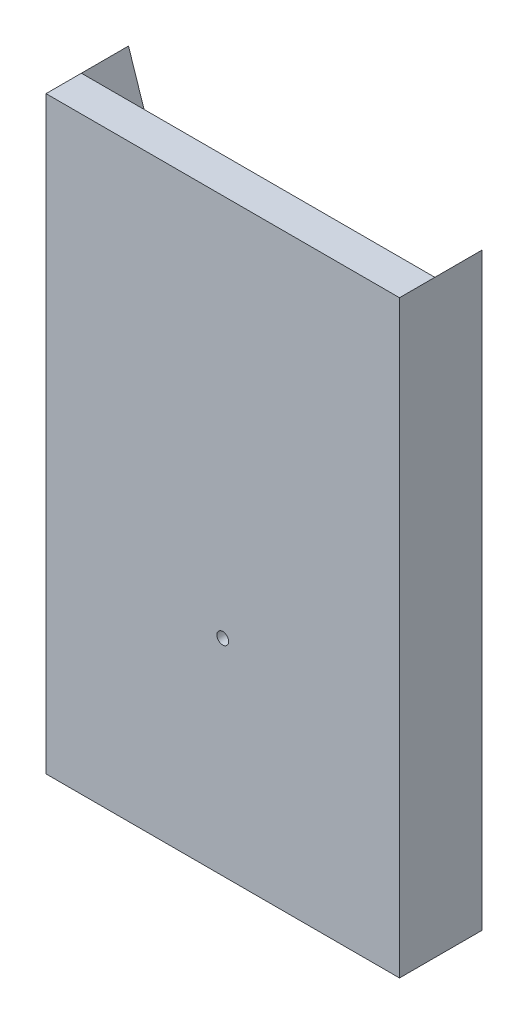
ISO-10303-21;
HEADER;
FILE_DESCRIPTION(('STEP AP214'),'2;1');
FILE_NAME('part.step','',(''),(''),'','','');
FILE_SCHEMA(('AUTOMOTIVE_DESIGN { 1 0 10303 214 1 1 1 1 }'));
ENDSEC;
DATA;
#1=APPLICATION_CONTEXT('core data for automotive mechanical design processes');
#2=APPLICATION_PROTOCOL_DEFINITION('international standard','automotive_design',2000,#1);
#3=PRODUCT_CONTEXT('',#1,'mechanical');
#4=PRODUCT('Part','Part','',(#3));
#5=PRODUCT_RELATED_PRODUCT_CATEGORY('part','',(#4));
#6=PRODUCT_DEFINITION_FORMATION('','',#4);
#7=PRODUCT_DEFINITION_CONTEXT('part definition',#1,'design');
#8=PRODUCT_DEFINITION('design','',#6,#7);
#9=PRODUCT_DEFINITION_SHAPE('','',#8);
#10=(LENGTH_UNIT() NAMED_UNIT(*) SI_UNIT(.MILLI.,.METRE.));
#11=(NAMED_UNIT(*) PLANE_ANGLE_UNIT() SI_UNIT($,.RADIAN.));
#12=(NAMED_UNIT(*) SI_UNIT($,.STERADIAN.) SOLID_ANGLE_UNIT());
#13=UNCERTAINTY_MEASURE_WITH_UNIT(LENGTH_MEASURE(1.E-05),#10,'distance_accuracy_value','');
#14=(GEOMETRIC_REPRESENTATION_CONTEXT(3) GLOBAL_UNCERTAINTY_ASSIGNED_CONTEXT((#13)) GLOBAL_UNIT_ASSIGNED_CONTEXT((#10,
#11,#12)) REPRESENTATION_CONTEXT('',''));
#15=CARTESIAN_POINT('',(0.,0.,0.));
#16=DIRECTION('',(0.,0.,1.));
#17=DIRECTION('',(1.,0.,0.));
#18=AXIS2_PLACEMENT_3D('',#15,#16,#17);
#19=CARTESIAN_POINT('',(0.,0.,0.));
#20=DIRECTION('',(0.,0.,1.));
#21=DIRECTION('',(1.,0.,0.));
#22=AXIS2_PLACEMENT_3D('',#19,#20,#21);
#23=PLANE('',#22);
#24=DIRECTION('',(0.313714078907655,-0.949517496781982,0.));
#25=VECTOR('',#24,1.);
#26=CARTESIAN_POINT('',(0.,0.,0.));
#27=LINE('',#26,#25);
#28=CARTESIAN_POINT('',(0.,0.,0.));
#29=VERTEX_POINT('',#28);
#30=CARTESIAN_POINT('',(44.9946453721645,-136.185163226119,0.));
#31=VERTEX_POINT('',#30);
#32=EDGE_CURVE('E129',#29,#31,#27,.T.);
#33=ORIENTED_EDGE('',*,*,#32,.T.);
#34=CARTESIAN_POINT('',(75.,-162.636603520701,0.));
#35=DIRECTION('',(0.,0.,1.));
#36=DIRECTION('',(1.,0.,0.));
#37=AXIS2_PLACEMENT_3D('',#34,#35,#36);
#38=CIRCLE('',#37,40.);
#39=CARTESIAN_POINT('',(44.9946453721645,-189.088043815283,0.));
#40=VERTEX_POINT('',#39);
#41=EDGE_CURVE('E197',#31,#40,#38,.T.);
#42=ORIENTED_EDGE('',*,*,#41,.T.);
#43=DIRECTION('',(-0.594158454407836,-0.804348016132129,0.));
#44=VECTOR('',#43,1.);
#45=CARTESIAN_POINT('',(44.9946453721645,-189.088043815283,0.));
#46=LINE('',#45,#44);
#47=CARTESIAN_POINT('',(0.,-250.,0.));
#48=VERTEX_POINT('',#47);
#49=EDGE_CURVE('E202',#40,#48,#46,.T.);
#50=ORIENTED_EDGE('',*,*,#49,.T.);
#51=DIRECTION('',(0.,-1.,0.));
#52=VECTOR('',#51,1.);
#53=CARTESIAN_POINT('',(0.,0.,0.));
#54=LINE('',#53,#52);
#55=EDGE_CURVE('E135',#29,#48,#54,.T.);
#56=ORIENTED_EDGE('',*,*,#55,.F.);
#57=EDGE_LOOP('',(#33,#42,#50,#56));
#58=FACE_BOUND('',#57,.T.);
#59=ADVANCED_FACE('F38',(#58),#23,.F.);
#60=DIRECTION('',(-0.594158454407835,0.804348016132129,0.));
#61=VECTOR('',#60,1.);
#62=CARTESIAN_POINT('',(105.005354627836,-189.088043815283,0.));
#63=LINE('',#62,#61);
#64=CARTESIAN_POINT('',(150.,-250.,0.));
#65=VERTEX_POINT('',#64);
#66=CARTESIAN_POINT('',(105.005354627836,-189.088043815283,0.));
#67=VERTEX_POINT('',#66);
#68=EDGE_CURVE('E206',#65,#67,#63,.T.);
#69=ORIENTED_EDGE('',*,*,#68,.T.);
#70=CARTESIAN_POINT('',(75.,-162.636603520701,0.));
#71=DIRECTION('',(0.,0.,1.));
#72=DIRECTION('',(1.,0.,0.));
#73=AXIS2_PLACEMENT_3D('',#70,#71,#72);
#74=CIRCLE('',#73,40.);
#75=CARTESIAN_POINT('',(105.005354627836,-136.185163226119,0.));
#76=VERTEX_POINT('',#75);
#77=EDGE_CURVE('E210',#67,#76,#74,.T.);
#78=ORIENTED_EDGE('',*,*,#77,.T.);
#79=DIRECTION('',(0.313714078907655,0.949517496781982,0.));
#80=VECTOR('',#79,1.);
#81=CARTESIAN_POINT('',(150.,0.,0.));
#82=LINE('',#81,#80);
#83=CARTESIAN_POINT('',(150.,0.,0.));
#84=VERTEX_POINT('',#83);
#85=EDGE_CURVE('E146',#76,#84,#82,.T.);
#86=ORIENTED_EDGE('',*,*,#85,.T.);
#87=DIRECTION('',(0.,1.,0.));
#88=VECTOR('',#87,1.);
#89=CARTESIAN_POINT('',(150.,0.,0.));
#90=LINE('',#89,#88);
#91=EDGE_CURVE('E158',#65,#84,#90,.T.);
#92=ORIENTED_EDGE('',*,*,#91,.F.);
#93=EDGE_LOOP('',(#69,#78,#86,#92));
#94=FACE_BOUND('',#93,.T.);
#95=ADVANCED_FACE('F244',(#94),#23,.F.);
#96=CARTESIAN_POINT('',(0.,0.,35.));
#97=DIRECTION('',(1.,0.,0.));
#98=DIRECTION('',(0.,1.,0.));
#99=AXIS2_PLACEMENT_3D('',#96,#97,#98);
#100=PLANE('',#99);
#101=ORIENTED_EDGE('',*,*,#55,.T.);
#102=DIRECTION('',(0.,0.,-1.));
#103=VECTOR('',#102,1.);
#104=CARTESIAN_POINT('',(0.,-250.,20.));
#105=LINE('',#104,#103);
#106=CARTESIAN_POINT('',(0.,-250.,20.));
#107=VERTEX_POINT('',#106);
#108=EDGE_CURVE('E228',#107,#48,#105,.T.);
#109=ORIENTED_EDGE('',*,*,#108,.F.);
#110=DIRECTION('',(0.,0.,-1.));
#111=VECTOR('',#110,1.);
#112=CARTESIAN_POINT('',(0.,-250.,35.));
#113=LINE('',#112,#111);
#114=CARTESIAN_POINT('',(0.,-250.,35.));
#115=VERTEX_POINT('',#114);
#116=EDGE_CURVE('E11',#115,#107,#113,.T.);
#117=ORIENTED_EDGE('',*,*,#116,.F.);
#118=DIRECTION('',(0.,-1.,0.));
#119=VECTOR('',#118,1.);
#120=CARTESIAN_POINT('',(0.,0.,35.));
#121=LINE('',#120,#119);
#122=CARTESIAN_POINT('',(0.,0.,35.));
#123=VERTEX_POINT('',#122);
#124=EDGE_CURVE('E149',#123,#115,#121,.T.);
#125=ORIENTED_EDGE('',*,*,#124,.F.);
#126=DIRECTION('',(0.,0.,-1.));
#127=VECTOR('',#126,1.);
#128=CARTESIAN_POINT('',(0.,0.,35.));
#129=LINE('',#128,#127);
#130=CARTESIAN_POINT('',(0.,0.,20.));
#131=VERTEX_POINT('',#130);
#132=EDGE_CURVE('E141',#123,#131,#129,.T.);
#133=ORIENTED_EDGE('',*,*,#132,.T.);
#134=DIRECTION('',(0.,0.,-1.));
#135=VECTOR('',#134,1.);
#136=CARTESIAN_POINT('',(0.,0.,20.));
#137=LINE('',#136,#135);
#138=EDGE_CURVE('E126',#131,#29,#137,.T.);
#139=ORIENTED_EDGE('',*,*,#138,.T.);
#140=EDGE_LOOP('',(#101,#109,#117,#125,#133,#139));
#141=FACE_BOUND('',#140,.T.);
#142=ADVANCED_FACE('F40',(#141),#100,.F.);
#143=CARTESIAN_POINT('',(0.,-250.,35.));
#144=DIRECTION('',(0.,1.,0.));
#145=DIRECTION('',(0.,0.,1.));
#146=AXIS2_PLACEMENT_3D('',#143,#144,#145);
#147=PLANE('',#146);
#148=ORIENTED_EDGE('',*,*,#116,.T.);
#149=DIRECTION('',(1.,0.,0.));
#150=VECTOR('',#149,1.);
#151=CARTESIAN_POINT('',(0.,-250.,20.));
#152=LINE('',#151,#150);
#153=CARTESIAN_POINT('',(150.,-250.,20.));
#154=VERTEX_POINT('',#153);
#155=EDGE_CURVE('E175',#107,#154,#152,.T.);
#156=ORIENTED_EDGE('',*,*,#155,.T.);
#157=DIRECTION('',(0.,0.,-1.));
#158=VECTOR('',#157,1.);
#159=CARTESIAN_POINT('',(150.,-250.,35.));
#160=LINE('',#159,#158);
#161=CARTESIAN_POINT('',(150.,-250.,35.));
#162=VERTEX_POINT('',#161);
#163=EDGE_CURVE('E48',#162,#154,#160,.T.);
#164=ORIENTED_EDGE('',*,*,#163,.F.);
#165=DIRECTION('',(1.,0.,0.));
#166=VECTOR('',#165,1.);
#167=CARTESIAN_POINT('',(0.,-250.,35.));
#168=LINE('',#167,#166);
#169=EDGE_CURVE('E173',#115,#162,#168,.T.);
#170=ORIENTED_EDGE('',*,*,#169,.F.);
#171=EDGE_LOOP('',(#148,#156,#164,#170));
#172=FACE_BOUND('',#171,.T.);
#173=ADVANCED_FACE('F172',(#172),#147,.F.);
#174=CARTESIAN_POINT('',(150.,0.,35.));
#175=DIRECTION('',(-1.,0.,0.));
#176=DIRECTION('',(0.,0.,1.));
#177=AXIS2_PLACEMENT_3D('',#174,#175,#176);
#178=PLANE('',#177);
#179=ORIENTED_EDGE('',*,*,#91,.T.);
#180=DIRECTION('',(0.,0.,-1.));
#181=VECTOR('',#180,1.);
#182=CARTESIAN_POINT('',(150.,0.,20.));
#183=LINE('',#182,#181);
#184=CARTESIAN_POINT('',(150.,0.,20.));
#185=VERTEX_POINT('',#184);
#186=EDGE_CURVE('E194',#185,#84,#183,.T.);
#187=ORIENTED_EDGE('',*,*,#186,.F.);
#188=DIRECTION('',(0.,0.,-1.));
#189=VECTOR('',#188,1.);
#190=CARTESIAN_POINT('',(150.,0.,35.));
#191=LINE('',#190,#189);
#192=CARTESIAN_POINT('',(150.,0.,35.));
#193=VERTEX_POINT('',#192);
#194=EDGE_CURVE('E144',#193,#185,#191,.T.);
#195=ORIENTED_EDGE('',*,*,#194,.F.);
#196=DIRECTION('',(0.,1.,0.));
#197=VECTOR('',#196,1.);
#198=CARTESIAN_POINT('',(150.,0.,35.));
#199=LINE('',#198,#197);
#200=EDGE_CURVE('E155',#162,#193,#199,.T.);
#201=ORIENTED_EDGE('',*,*,#200,.F.);
#202=ORIENTED_EDGE('',*,*,#163,.T.);
#203=DIRECTION('',(0.,0.,-1.));
#204=VECTOR('',#203,1.);
#205=CARTESIAN_POINT('',(150.,-250.,20.));
#206=LINE('',#205,#204);
#207=EDGE_CURVE('E168',#154,#65,#206,.T.);
#208=ORIENTED_EDGE('',*,*,#207,.T.);
#209=EDGE_LOOP('',(#179,#187,#195,#201,#202,#208));
#210=FACE_BOUND('',#209,.T.);
#211=ADVANCED_FACE('F167',(#210),#178,.F.);
#212=CARTESIAN_POINT('',(0.,0.,35.));
#213=DIRECTION('',(0.,-1.,0.));
#214=DIRECTION('',(0.,0.,-1.));
#215=AXIS2_PLACEMENT_3D('',#212,#213,#214);
#216=PLANE('',#215);
#217=ORIENTED_EDGE('',*,*,#194,.T.);
#218=DIRECTION('',(-1.,0.,0.));
#219=VECTOR('',#218,1.);
#220=CARTESIAN_POINT('',(0.,0.,20.));
#221=LINE('',#220,#219);
#222=EDGE_CURVE('E117',#185,#131,#221,.T.);
#223=ORIENTED_EDGE('',*,*,#222,.T.);
#224=ORIENTED_EDGE('',*,*,#132,.F.);
#225=DIRECTION('',(-1.,0.,0.));
#226=VECTOR('',#225,1.);
#227=CARTESIAN_POINT('',(0.,0.,35.));
#228=LINE('',#227,#226);
#229=EDGE_CURVE('E55',#193,#123,#228,.T.);
#230=ORIENTED_EDGE('',*,*,#229,.F.);
#231=EDGE_LOOP('',(#217,#223,#224,#230));
#232=FACE_BOUND('',#231,.T.);
#233=ADVANCED_FACE('F140',(#232),#216,.F.);
#234=CARTESIAN_POINT('',(0.,0.,35.));
#235=DIRECTION('',(0.,0.,1.));
#236=DIRECTION('',(1.,0.,0.));
#237=AXIS2_PLACEMENT_3D('',#234,#235,#236);
#238=PLANE('',#237);
#239=CARTESIAN_POINT('',(75.,-162.636603520701,35.));
#240=DIRECTION('',(0.,0.,-1.));
#241=DIRECTION('',(-1.,0.,0.));
#242=AXIS2_PLACEMENT_3D('',#239,#240,#241);
#243=CIRCLE('',#242,2.5);
#244=CARTESIAN_POINT('',(72.5,-162.636603520701,35.));
#245=VERTEX_POINT('',#244);
#246=EDGE_CURVE('E198',#245,#245,#243,.T.);
#247=ORIENTED_EDGE('',*,*,#246,.T.);
#248=EDGE_LOOP('',(#247));
#249=FACE_BOUND('',#248,.T.);
#250=ORIENTED_EDGE('',*,*,#124,.T.);
#251=ORIENTED_EDGE('',*,*,#169,.T.);
#252=ORIENTED_EDGE('',*,*,#200,.T.);
#253=ORIENTED_EDGE('',*,*,#229,.T.);
#254=EDGE_LOOP('',(#250,#251,#252,#253));
#255=FACE_BOUND('',#254,.T.);
#256=ADVANCED_FACE('F275',(#249,#255),#238,.T.);
#257=CARTESIAN_POINT('',(0.,0.,20.));
#258=DIRECTION('',(0.949517496781982,0.313714078907655,0.));
#259=DIRECTION('',(-0.313714078907655,0.949517496781982,0.));
#260=AXIS2_PLACEMENT_3D('',#257,#258,#259);
#261=PLANE('',#260);
#262=ORIENTED_EDGE('',*,*,#32,.F.);
#263=ORIENTED_EDGE('',*,*,#138,.F.);
#264=DIRECTION('',(0.313714078907655,-0.949517496781982,0.));
#265=VECTOR('',#264,1.);
#266=CARTESIAN_POINT('',(0.,0.,20.));
#267=LINE('',#266,#265);
#268=CARTESIAN_POINT('',(44.9946453721645,-136.185163226119,20.));
#269=VERTEX_POINT('',#268);
#270=EDGE_CURVE('E112',#131,#269,#267,.T.);
#271=ORIENTED_EDGE('',*,*,#270,.T.);
#272=DIRECTION('',(0.,0.,-1.));
#273=VECTOR('',#272,1.);
#274=CARTESIAN_POINT('',(44.9946453721645,-136.185163226119,20.));
#275=LINE('',#274,#273);
#276=EDGE_CURVE('E136',#269,#31,#275,.T.);
#277=ORIENTED_EDGE('',*,*,#276,.T.);
#278=EDGE_LOOP('',(#262,#263,#271,#277));
#279=FACE_BOUND('',#278,.T.);
#280=ADVANCED_FACE('F127',(#279),#261,.T.);
#281=CARTESIAN_POINT('',(75.,-162.636603520701,20.));
#282=DIRECTION('',(0.,0.,-1.));
#283=DIRECTION('',(-1.,0.,0.));
#284=AXIS2_PLACEMENT_3D('',#281,#282,#283);
#285=CYLINDRICAL_SURFACE('',#284,40.);
#286=ORIENTED_EDGE('',*,*,#41,.F.);
#287=ORIENTED_EDGE('',*,*,#276,.F.);
#288=CARTESIAN_POINT('',(75.,-162.636603520701,20.));
#289=DIRECTION('',(0.,0.,1.));
#290=DIRECTION('',(1.,0.,0.));
#291=AXIS2_PLACEMENT_3D('',#288,#289,#290);
#292=CIRCLE('',#291,40.);
#293=CARTESIAN_POINT('',(44.9946453721645,-189.088043815283,20.));
#294=VERTEX_POINT('',#293);
#295=EDGE_CURVE('E120',#269,#294,#292,.T.);
#296=ORIENTED_EDGE('',*,*,#295,.T.);
#297=DIRECTION('',(0.,0.,-1.));
#298=VECTOR('',#297,1.);
#299=CARTESIAN_POINT('',(44.9946453721645,-189.088043815283,20.));
#300=LINE('',#299,#298);
#301=EDGE_CURVE('E231',#294,#40,#300,.T.);
#302=ORIENTED_EDGE('',*,*,#301,.T.);
#303=EDGE_LOOP('',(#286,#287,#296,#302));
#304=FACE_BOUND('',#303,.T.);
#305=ADVANCED_FACE('F264',(#304),#285,.F.);
#306=CARTESIAN_POINT('',(44.9946453721645,-189.088043815283,20.));
#307=DIRECTION('',(0.804348016132129,-0.594158454407836,0.));
#308=DIRECTION('',(0.594158454407836,0.804348016132129,0.));
#309=AXIS2_PLACEMENT_3D('',#306,#307,#308);
#310=PLANE('',#309);
#311=ORIENTED_EDGE('',*,*,#49,.F.);
#312=ORIENTED_EDGE('',*,*,#301,.F.);
#313=DIRECTION('',(-0.594158454407836,-0.804348016132129,0.));
#314=VECTOR('',#313,1.);
#315=CARTESIAN_POINT('',(44.9946453721645,-189.088043815283,20.));
#316=LINE('',#315,#314);
#317=EDGE_CURVE('E180',#294,#107,#316,.T.);
#318=ORIENTED_EDGE('',*,*,#317,.T.);
#319=ORIENTED_EDGE('',*,*,#108,.T.);
#320=EDGE_LOOP('',(#311,#312,#318,#319));
#321=FACE_BOUND('',#320,.T.);
#322=ADVANCED_FACE('F257',(#321),#310,.T.);
#323=CARTESIAN_POINT('',(105.005354627836,-189.088043815283,20.));
#324=DIRECTION('',(-0.804348016132129,-0.594158454407836,0.));
#325=DIRECTION('',(0.594158454407836,-0.804348016132129,0.));
#326=AXIS2_PLACEMENT_3D('',#323,#324,#325);
#327=PLANE('',#326);
#328=ORIENTED_EDGE('',*,*,#68,.F.);
#329=ORIENTED_EDGE('',*,*,#207,.F.);
#330=DIRECTION('',(-0.594158454407835,0.804348016132129,0.));
#331=VECTOR('',#330,1.);
#332=CARTESIAN_POINT('',(105.005354627836,-189.088043815283,20.));
#333=LINE('',#332,#331);
#334=CARTESIAN_POINT('',(105.005354627836,-189.088043815283,20.));
#335=VERTEX_POINT('',#334);
#336=EDGE_CURVE('E179',#154,#335,#333,.T.);
#337=ORIENTED_EDGE('',*,*,#336,.T.);
#338=DIRECTION('',(0.,0.,-1.));
#339=VECTOR('',#338,1.);
#340=CARTESIAN_POINT('',(105.005354627836,-189.088043815283,20.));
#341=LINE('',#340,#339);
#342=EDGE_CURVE('E223',#335,#67,#341,.T.);
#343=ORIENTED_EDGE('',*,*,#342,.T.);
#344=EDGE_LOOP('',(#328,#329,#337,#343));
#345=FACE_BOUND('',#344,.T.);
#346=ADVANCED_FACE('F255',(#345),#327,.T.);
#347=CARTESIAN_POINT('',(75.,-162.636603520701,20.));
#348=DIRECTION('',(0.,0.,-1.));
#349=DIRECTION('',(-1.,0.,0.));
#350=AXIS2_PLACEMENT_3D('',#347,#348,#349);
#351=CYLINDRICAL_SURFACE('',#350,40.);
#352=ORIENTED_EDGE('',*,*,#77,.F.);
#353=ORIENTED_EDGE('',*,*,#342,.F.);
#354=CARTESIAN_POINT('',(75.,-162.636603520701,20.));
#355=DIRECTION('',(0.,0.,1.));
#356=DIRECTION('',(1.,0.,0.));
#357=AXIS2_PLACEMENT_3D('',#354,#355,#356);
#358=CIRCLE('',#357,40.);
#359=CARTESIAN_POINT('',(105.005354627836,-136.185163226119,20.));
#360=VERTEX_POINT('',#359);
#361=EDGE_CURVE('E184',#335,#360,#358,.T.);
#362=ORIENTED_EDGE('',*,*,#361,.T.);
#363=DIRECTION('',(0.,0.,-1.));
#364=VECTOR('',#363,1.);
#365=CARTESIAN_POINT('',(105.005354627836,-136.185163226119,20.));
#366=LINE('',#365,#364);
#367=EDGE_CURVE('E220',#360,#76,#366,.T.);
#368=ORIENTED_EDGE('',*,*,#367,.T.);
#369=EDGE_LOOP('',(#352,#353,#362,#368));
#370=FACE_BOUND('',#369,.T.);
#371=ADVANCED_FACE('F253',(#370),#351,.F.);
#372=CARTESIAN_POINT('',(150.,0.,20.));
#373=DIRECTION('',(-0.949517496781982,0.313714078907655,0.));
#374=DIRECTION('',(-0.313714078907655,-0.949517496781982,0.));
#375=AXIS2_PLACEMENT_3D('',#372,#373,#374);
#376=PLANE('',#375);
#377=ORIENTED_EDGE('',*,*,#85,.F.);
#378=ORIENTED_EDGE('',*,*,#367,.F.);
#379=DIRECTION('',(0.313714078907655,0.949517496781982,0.));
#380=VECTOR('',#379,1.);
#381=CARTESIAN_POINT('',(150.,0.,20.));
#382=LINE('',#381,#380);
#383=EDGE_CURVE('E191',#360,#185,#382,.T.);
#384=ORIENTED_EDGE('',*,*,#383,.T.);
#385=ORIENTED_EDGE('',*,*,#186,.T.);
#386=EDGE_LOOP('',(#377,#378,#384,#385));
#387=FACE_BOUND('',#386,.T.);
#388=ADVANCED_FACE('F249',(#387),#376,.T.);
#389=CARTESIAN_POINT('',(75.,-162.636603520701,20.));
#390=DIRECTION('',(0.,0.,1.));
#391=DIRECTION('',(1.,0.,0.));
#392=AXIS2_PLACEMENT_3D('',#389,#390,#391);
#393=PLANE('',#392);
#394=CARTESIAN_POINT('',(75.,-162.636603520701,20.));
#395=DIRECTION('',(0.,0.,-1.));
#396=DIRECTION('',(-1.,0.,0.));
#397=AXIS2_PLACEMENT_3D('',#394,#395,#396);
#398=CIRCLE('',#397,2.5);
#399=CARTESIAN_POINT('',(72.5,-162.636603520701,20.));
#400=VERTEX_POINT('',#399);
#401=EDGE_CURVE('E388',#400,#400,#398,.T.);
#402=ORIENTED_EDGE('',*,*,#401,.F.);
#403=EDGE_LOOP('',(#402));
#404=FACE_BOUND('',#403,.T.);
#405=ORIENTED_EDGE('',*,*,#222,.F.);
#406=ORIENTED_EDGE('',*,*,#383,.F.);
#407=ORIENTED_EDGE('',*,*,#361,.F.);
#408=ORIENTED_EDGE('',*,*,#336,.F.);
#409=ORIENTED_EDGE('',*,*,#155,.F.);
#410=ORIENTED_EDGE('',*,*,#317,.F.);
#411=ORIENTED_EDGE('',*,*,#295,.F.);
#412=ORIENTED_EDGE('',*,*,#270,.F.);
#413=EDGE_LOOP('',(#405,#406,#407,#408,#409,#410,#411,#412));
#414=FACE_BOUND('',#413,.T.);
#415=ADVANCED_FACE('F114',(#404,#414),#393,.F.);
#416=CARTESIAN_POINT('',(75.,-162.636603520701,35.));
#417=DIRECTION('',(0.,0.,-1.));
#418=DIRECTION('',(-1.,0.,0.));
#419=AXIS2_PLACEMENT_3D('',#416,#417,#418);
#420=CYLINDRICAL_SURFACE('',#419,2.5);
#421=ORIENTED_EDGE('',*,*,#246,.F.);
#422=EDGE_LOOP('',(#421));
#423=FACE_BOUND('',#422,.T.);
#424=ORIENTED_EDGE('',*,*,#401,.T.);
#425=EDGE_LOOP('',(#424));
#426=FACE_BOUND('',#425,.T.);
#427=ADVANCED_FACE('F342',(#423,#426),#420,.F.);
#428=CLOSED_SHELL('',(#59,#95,#142,#173,#211,#233,#256,#280,#305,#322,#346,#371,#388,#415,#427));
#429=MANIFOLD_SOLID_BREP('B2',#428);
#430=ADVANCED_BREP_SHAPE_REPRESENTATION('',(#18,#429),#14);
#431=SHAPE_DEFINITION_REPRESENTATION(#9,#430);
ENDSEC;
END-ISO-10303-21;
